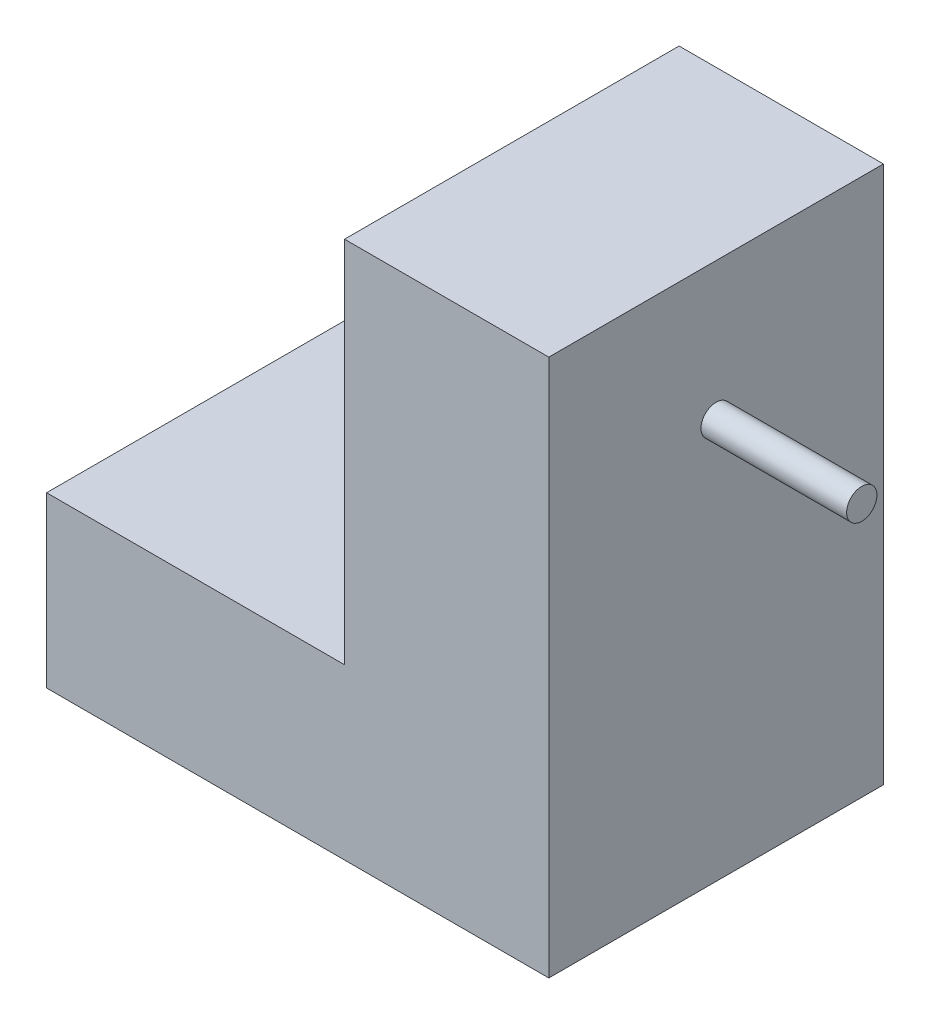
ISO-10303-21;
HEADER;
FILE_DESCRIPTION(('STEP AP214'),'2;1');
FILE_NAME('part.step','',(''),(''),'','','');
FILE_SCHEMA(('AUTOMOTIVE_DESIGN { 1 0 10303 214 1 1 1 1 }'));
ENDSEC;
DATA;
#1=APPLICATION_CONTEXT('core data for automotive mechanical design processes');
#2=APPLICATION_PROTOCOL_DEFINITION('international standard','automotive_design',2000,#1);
#3=PRODUCT_CONTEXT('',#1,'mechanical');
#4=PRODUCT('Part','Part','',(#3));
#5=PRODUCT_RELATED_PRODUCT_CATEGORY('part','',(#4));
#6=PRODUCT_DEFINITION_FORMATION('','',#4);
#7=PRODUCT_DEFINITION_CONTEXT('part definition',#1,'design');
#8=PRODUCT_DEFINITION('design','',#6,#7);
#9=PRODUCT_DEFINITION_SHAPE('','',#8);
#10=(LENGTH_UNIT() NAMED_UNIT(*) SI_UNIT(.MILLI.,.METRE.));
#11=(NAMED_UNIT(*) PLANE_ANGLE_UNIT() SI_UNIT($,.RADIAN.));
#12=(NAMED_UNIT(*) SI_UNIT($,.STERADIAN.) SOLID_ANGLE_UNIT());
#13=UNCERTAINTY_MEASURE_WITH_UNIT(LENGTH_MEASURE(1.E-05),#10,'distance_accuracy_value','');
#14=(GEOMETRIC_REPRESENTATION_CONTEXT(3) GLOBAL_UNCERTAINTY_ASSIGNED_CONTEXT((#13)) GLOBAL_UNIT_ASSIGNED_CONTEXT((#10,
#11,#12)) REPRESENTATION_CONTEXT('',''));
#15=CARTESIAN_POINT('',(0.,0.,0.));
#16=DIRECTION('',(0.,0.,1.));
#17=DIRECTION('',(1.,0.,0.));
#18=AXIS2_PLACEMENT_3D('',#15,#16,#17);
#19=CARTESIAN_POINT('',(17.,11.45,11.325));
#20=DIRECTION('',(-1.,0.,0.));
#21=DIRECTION('',(0.,0.,1.));
#22=AXIS2_PLACEMENT_3D('',#19,#20,#21);
#23=PLANE('',#22);
#24=DIRECTION('',(0.,0.,-1.));
#25=VECTOR('',#24,1.);
#26=CARTESIAN_POINT('',(17.,0.,11.325));
#27=LINE('',#26,#25);
#28=CARTESIAN_POINT('',(17.,0.,11.325));
#29=VERTEX_POINT('',#28);
#30=CARTESIAN_POINT('',(17.,0.,-11.325));
#31=VERTEX_POINT('',#30);
#32=EDGE_CURVE('E94',#29,#31,#27,.T.);
#33=ORIENTED_EDGE('',*,*,#32,.T.);
#34=DIRECTION('',(0.,-1.,0.));
#35=VECTOR('',#34,1.);
#36=CARTESIAN_POINT('',(17.,11.45,-11.325));
#37=LINE('',#36,#35);
#38=CARTESIAN_POINT('',(17.,36.4,-11.325));
#39=VERTEX_POINT('',#38);
#40=EDGE_CURVE('E42',#39,#31,#37,.T.);
#41=ORIENTED_EDGE('',*,*,#40,.F.);
#42=DIRECTION('',(0.,0.,-1.));
#43=VECTOR('',#42,1.);
#44=CARTESIAN_POINT('',(17.,36.4,-11.325));
#45=LINE('',#44,#43);
#46=CARTESIAN_POINT('',(17.,36.4,11.325));
#47=VERTEX_POINT('',#46);
#48=EDGE_CURVE('E96',#47,#39,#45,.T.);
#49=ORIENTED_EDGE('',*,*,#48,.F.);
#50=DIRECTION('',(0.,-1.,0.));
#51=VECTOR('',#50,1.);
#52=CARTESIAN_POINT('',(17.,11.45,11.325));
#53=LINE('',#52,#51);
#54=EDGE_CURVE('E79',#47,#29,#53,.T.);
#55=ORIENTED_EDGE('',*,*,#54,.T.);
#56=EDGE_LOOP('',(#33,#41,#49,#55));
#57=FACE_BOUND('',#56,.T.);
#58=CARTESIAN_POINT('',(17.,27.07,0.));
#59=DIRECTION('',(-1.,0.,0.));
#60=DIRECTION('',(0.,0.,1.));
#61=AXIS2_PLACEMENT_3D('',#58,#59,#60);
#62=CIRCLE('',#61,1.025);
#63=CARTESIAN_POINT('',(17.,27.07,1.025));
#64=VERTEX_POINT('',#63);
#65=EDGE_CURVE('E11',#64,#64,#62,.F.);
#66=ORIENTED_EDGE('',*,*,#65,.F.);
#67=EDGE_LOOP('',(#66));
#68=FACE_BOUND('',#67,.T.);
#69=ADVANCED_FACE('F35',(#57,#68),#23,.F.);
#70=CARTESIAN_POINT('',(0.,11.45,0.));
#71=DIRECTION('',(0.,-1.,0.));
#72=DIRECTION('',(0.,0.,-1.));
#73=AXIS2_PLACEMENT_3D('',#70,#71,#72);
#74=PLANE('',#73);
#75=DIRECTION('',(0.,0.,1.));
#76=VECTOR('',#75,1.);
#77=CARTESIAN_POINT('',(3.17,11.45,-11.325));
#78=LINE('',#77,#76);
#79=CARTESIAN_POINT('',(3.17000000000001,11.45,-11.325));
#80=VERTEX_POINT('',#79);
#81=CARTESIAN_POINT('',(3.17000000000001,11.45,11.325));
#82=VERTEX_POINT('',#81);
#83=EDGE_CURVE('E49',#80,#82,#78,.T.);
#84=ORIENTED_EDGE('',*,*,#83,.F.);
#85=DIRECTION('',(-1.,0.,0.));
#86=VECTOR('',#85,1.);
#87=CARTESIAN_POINT('',(-17.,11.45,-11.325));
#88=LINE('',#87,#86);
#89=CARTESIAN_POINT('',(-17.,11.45,-11.325));
#90=VERTEX_POINT('',#89);
#91=EDGE_CURVE('E86',#80,#90,#88,.T.);
#92=ORIENTED_EDGE('',*,*,#91,.T.);
#93=DIRECTION('',(0.,0.,1.));
#94=VECTOR('',#93,1.);
#95=CARTESIAN_POINT('',(-17.,11.45,11.325));
#96=LINE('',#95,#94);
#97=CARTESIAN_POINT('',(-17.,11.45,11.325));
#98=VERTEX_POINT('',#97);
#99=EDGE_CURVE('E55',#90,#98,#96,.T.);
#100=ORIENTED_EDGE('',*,*,#99,.T.);
#101=DIRECTION('',(1.,0.,0.));
#102=VECTOR('',#101,1.);
#103=CARTESIAN_POINT('',(-17.,11.45,11.325));
#104=LINE('',#103,#102);
#105=EDGE_CURVE('E97',#98,#82,#104,.T.);
#106=ORIENTED_EDGE('',*,*,#105,.T.);
#107=EDGE_LOOP('',(#84,#92,#100,#106));
#108=FACE_BOUND('',#107,.T.);
#109=ADVANCED_FACE('F126',(#108),#74,.F.);
#110=CARTESIAN_POINT('',(-17.,11.45,-11.325));
#111=DIRECTION('',(0.,0.,1.));
#112=DIRECTION('',(1.,0.,0.));
#113=AXIS2_PLACEMENT_3D('',#110,#111,#112);
#114=PLANE('',#113);
#115=DIRECTION('',(-1.,0.,0.));
#116=VECTOR('',#115,1.);
#117=CARTESIAN_POINT('',(-17.,0.,-11.325));
#118=LINE('',#117,#116);
#119=CARTESIAN_POINT('',(-17.,0.,-11.325));
#120=VERTEX_POINT('',#119);
#121=EDGE_CURVE('E100',#31,#120,#118,.T.);
#122=ORIENTED_EDGE('',*,*,#121,.T.);
#123=DIRECTION('',(0.,-1.,0.));
#124=VECTOR('',#123,1.);
#125=CARTESIAN_POINT('',(-17.,11.45,-11.325));
#126=LINE('',#125,#124);
#127=EDGE_CURVE('E114',#90,#120,#126,.T.);
#128=ORIENTED_EDGE('',*,*,#127,.F.);
#129=ORIENTED_EDGE('',*,*,#91,.F.);
#130=DIRECTION('',(0.,-1.,0.));
#131=VECTOR('',#130,1.);
#132=CARTESIAN_POINT('',(3.17,36.4,-11.325));
#133=LINE('',#132,#131);
#134=CARTESIAN_POINT('',(3.17,36.4,-11.325));
#135=VERTEX_POINT('',#134);
#136=EDGE_CURVE('E102',#135,#80,#133,.T.);
#137=ORIENTED_EDGE('',*,*,#136,.F.);
#138=DIRECTION('',(-1.,0.,0.));
#139=VECTOR('',#138,1.);
#140=CARTESIAN_POINT('',(17.,36.4,-11.325));
#141=LINE('',#140,#139);
#142=EDGE_CURVE('E144',#39,#135,#141,.T.);
#143=ORIENTED_EDGE('',*,*,#142,.F.);
#144=ORIENTED_EDGE('',*,*,#40,.T.);
#145=EDGE_LOOP('',(#122,#128,#129,#137,#143,#144));
#146=FACE_BOUND('',#145,.T.);
#147=ADVANCED_FACE('F165',(#146),#114,.F.);
#148=CARTESIAN_POINT('',(-17.,11.45,11.325));
#149=DIRECTION('',(1.,0.,0.));
#150=DIRECTION('',(0.,0.,-1.));
#151=AXIS2_PLACEMENT_3D('',#148,#149,#150);
#152=PLANE('',#151);
#153=DIRECTION('',(0.,0.,1.));
#154=VECTOR('',#153,1.);
#155=CARTESIAN_POINT('',(-17.,0.,11.325));
#156=LINE('',#155,#154);
#157=CARTESIAN_POINT('',(-17.,0.,11.325));
#158=VERTEX_POINT('',#157);
#159=EDGE_CURVE('E87',#120,#158,#156,.T.);
#160=ORIENTED_EDGE('',*,*,#159,.T.);
#161=DIRECTION('',(0.,-1.,0.));
#162=VECTOR('',#161,1.);
#163=CARTESIAN_POINT('',(-17.,11.45,11.325));
#164=LINE('',#163,#162);
#165=EDGE_CURVE('E82',#98,#158,#164,.T.);
#166=ORIENTED_EDGE('',*,*,#165,.F.);
#167=ORIENTED_EDGE('',*,*,#99,.F.);
#168=ORIENTED_EDGE('',*,*,#127,.T.);
#169=EDGE_LOOP('',(#160,#166,#167,#168));
#170=FACE_BOUND('',#169,.T.);
#171=ADVANCED_FACE('F170',(#170),#152,.F.);
#172=CARTESIAN_POINT('',(-17.,11.45,11.325));
#173=DIRECTION('',(0.,0.,-1.));
#174=DIRECTION('',(-1.,0.,0.));
#175=AXIS2_PLACEMENT_3D('',#172,#173,#174);
#176=PLANE('',#175);
#177=DIRECTION('',(1.,0.,0.));
#178=VECTOR('',#177,1.);
#179=CARTESIAN_POINT('',(-17.,0.,11.325));
#180=LINE('',#179,#178);
#181=EDGE_CURVE('E75',#158,#29,#180,.T.);
#182=ORIENTED_EDGE('',*,*,#181,.T.);
#183=ORIENTED_EDGE('',*,*,#54,.F.);
#184=DIRECTION('',(1.,0.,0.));
#185=VECTOR('',#184,1.);
#186=CARTESIAN_POINT('',(17.,36.4,11.325));
#187=LINE('',#186,#185);
#188=CARTESIAN_POINT('',(3.17000000000001,36.4,11.325));
#189=VERTEX_POINT('',#188);
#190=EDGE_CURVE('E136',#189,#47,#187,.T.);
#191=ORIENTED_EDGE('',*,*,#190,.F.);
#192=DIRECTION('',(0.,-1.,0.));
#193=VECTOR('',#192,1.);
#194=CARTESIAN_POINT('',(3.17000000000001,36.4,11.325));
#195=LINE('',#194,#193);
#196=EDGE_CURVE('E106',#189,#82,#195,.T.);
#197=ORIENTED_EDGE('',*,*,#196,.T.);
#198=ORIENTED_EDGE('',*,*,#105,.F.);
#199=ORIENTED_EDGE('',*,*,#165,.T.);
#200=EDGE_LOOP('',(#182,#183,#191,#197,#198,#199));
#201=FACE_BOUND('',#200,.T.);
#202=ADVANCED_FACE('F77',(#201),#176,.F.);
#203=CARTESIAN_POINT('',(0.,0.,0.));
#204=DIRECTION('',(0.,-1.,0.));
#205=DIRECTION('',(0.,0.,-1.));
#206=AXIS2_PLACEMENT_3D('',#203,#204,#205);
#207=PLANE('',#206);
#208=ORIENTED_EDGE('',*,*,#32,.F.);
#209=ORIENTED_EDGE('',*,*,#181,.F.);
#210=ORIENTED_EDGE('',*,*,#159,.F.);
#211=ORIENTED_EDGE('',*,*,#121,.F.);
#212=EDGE_LOOP('',(#208,#209,#210,#211));
#213=FACE_BOUND('',#212,.T.);
#214=ADVANCED_FACE('F99',(#213),#207,.T.);
#215=CARTESIAN_POINT('',(3.17,36.4,-11.325));
#216=DIRECTION('',(1.,0.,0.));
#217=DIRECTION('',(0.,0.,-1.));
#218=AXIS2_PLACEMENT_3D('',#215,#216,#217);
#219=PLANE('',#218);
#220=ORIENTED_EDGE('',*,*,#83,.T.);
#221=ORIENTED_EDGE('',*,*,#196,.F.);
#222=DIRECTION('',(0.,0.,1.));
#223=VECTOR('',#222,1.);
#224=CARTESIAN_POINT('',(3.17,36.4,-11.325));
#225=LINE('',#224,#223);
#226=EDGE_CURVE('E138',#135,#189,#225,.T.);
#227=ORIENTED_EDGE('',*,*,#226,.F.);
#228=ORIENTED_EDGE('',*,*,#136,.T.);
#229=EDGE_LOOP('',(#220,#221,#227,#228));
#230=FACE_BOUND('',#229,.T.);
#231=ADVANCED_FACE('F131',(#230),#219,.F.);
#232=CARTESIAN_POINT('',(0.,36.4,0.));
#233=DIRECTION('',(0.,-1.,0.));
#234=DIRECTION('',(0.,0.,-1.));
#235=AXIS2_PLACEMENT_3D('',#232,#233,#234);
#236=PLANE('',#235);
#237=ORIENTED_EDGE('',*,*,#48,.T.);
#238=ORIENTED_EDGE('',*,*,#142,.T.);
#239=ORIENTED_EDGE('',*,*,#226,.T.);
#240=ORIENTED_EDGE('',*,*,#190,.T.);
#241=EDGE_LOOP('',(#237,#238,#239,#240));
#242=FACE_BOUND('',#241,.T.);
#243=ADVANCED_FACE('F158',(#242),#236,.F.);
#244=CARTESIAN_POINT('',(26.86,27.07,0.));
#245=DIRECTION('',(-1.,0.,0.));
#246=DIRECTION('',(0.,0.,1.));
#247=AXIS2_PLACEMENT_3D('',#244,#245,#246);
#248=CYLINDRICAL_SURFACE('',#247,1.025);
#249=CARTESIAN_POINT('',(26.86,27.07,0.));
#250=DIRECTION('',(1.,0.,0.));
#251=DIRECTION('',(0.,0.,-1.));
#252=AXIS2_PLACEMENT_3D('',#249,#250,#251);
#253=CIRCLE('',#252,1.025);
#254=CARTESIAN_POINT('',(26.86,27.07,-1.025));
#255=VERTEX_POINT('',#254);
#256=EDGE_CURVE('E135',#255,#255,#253,.T.);
#257=ORIENTED_EDGE('',*,*,#256,.F.);
#258=EDGE_LOOP('',(#257));
#259=FACE_BOUND('',#258,.T.);
#260=ORIENTED_EDGE('',*,*,#65,.T.);
#261=EDGE_LOOP('',(#260));
#262=FACE_BOUND('',#261,.T.);
#263=ADVANCED_FACE('F155',(#259,#262),#248,.T.);
#264=CARTESIAN_POINT('',(26.86,27.07,0.));
#265=DIRECTION('',(1.,0.,0.));
#266=DIRECTION('',(0.,0.,-1.));
#267=AXIS2_PLACEMENT_3D('',#264,#265,#266);
#268=PLANE('',#267);
#269=ORIENTED_EDGE('',*,*,#256,.T.);
#270=EDGE_LOOP('',(#269));
#271=FACE_BOUND('',#270,.T.);
#272=ADVANCED_FACE('F153',(#271),#268,.T.);
#273=CLOSED_SHELL('',(#69,#109,#147,#171,#202,#214,#231,#243,#263,#272));
#274=MANIFOLD_SOLID_BREP('B2',#273);
#275=ADVANCED_BREP_SHAPE_REPRESENTATION('',(#18,#274),#14);
#276=SHAPE_DEFINITION_REPRESENTATION(#9,#275);
ENDSEC;
END-ISO-10303-21;
